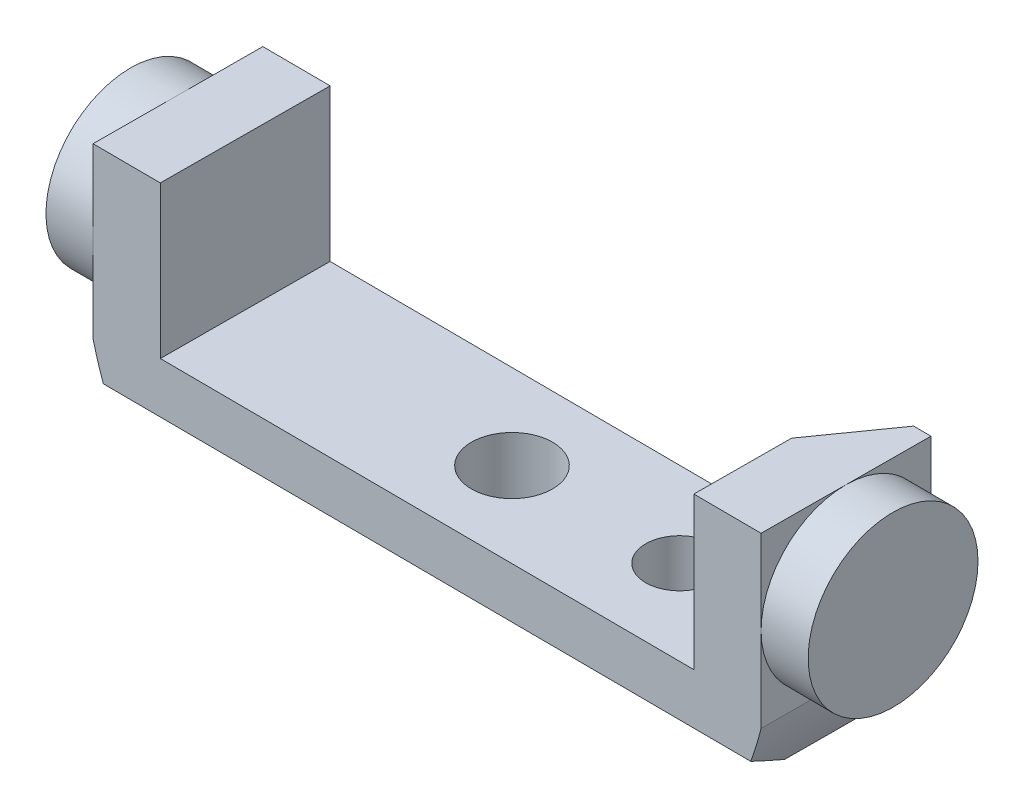
ISO-10303-21;
HEADER;
FILE_DESCRIPTION(('STEP AP214'),'2;1');
FILE_NAME('part.step','',(''),(''),'','','');
FILE_SCHEMA(('AUTOMOTIVE_DESIGN { 1 0 10303 214 1 1 1 1 }'));
ENDSEC;
DATA;
#1=APPLICATION_CONTEXT('core data for automotive mechanical design processes');
#2=APPLICATION_PROTOCOL_DEFINITION('international standard','automotive_design',2000,#1);
#3=PRODUCT_CONTEXT('',#1,'mechanical');
#4=PRODUCT('Part','Part','',(#3));
#5=PRODUCT_RELATED_PRODUCT_CATEGORY('part','',(#4));
#6=PRODUCT_DEFINITION_FORMATION('','',#4);
#7=PRODUCT_DEFINITION_CONTEXT('part definition',#1,'design');
#8=PRODUCT_DEFINITION('design','',#6,#7);
#9=PRODUCT_DEFINITION_SHAPE('','',#8);
#10=(LENGTH_UNIT() NAMED_UNIT(*) SI_UNIT(.MILLI.,.METRE.));
#11=(NAMED_UNIT(*) PLANE_ANGLE_UNIT() SI_UNIT($,.RADIAN.));
#12=(NAMED_UNIT(*) SI_UNIT($,.STERADIAN.) SOLID_ANGLE_UNIT());
#13=UNCERTAINTY_MEASURE_WITH_UNIT(LENGTH_MEASURE(1.E-05),#10,'distance_accuracy_value','');
#14=(GEOMETRIC_REPRESENTATION_CONTEXT(3) GLOBAL_UNCERTAINTY_ASSIGNED_CONTEXT((#13)) GLOBAL_UNIT_ASSIGNED_CONTEXT((#10,
#11,#12)) REPRESENTATION_CONTEXT('',''));
#15=CARTESIAN_POINT('',(0.,0.,0.));
#16=DIRECTION('',(0.,0.,1.));
#17=DIRECTION('',(1.,0.,0.));
#18=AXIS2_PLACEMENT_3D('',#15,#16,#17);
#19=CARTESIAN_POINT('',(0.0124960993634603,-0.875000014901161,-2.49996876930507));
#20=DIRECTION('',(0.00499843974538349,0.,-0.999987507722027));
#21=DIRECTION('',(0.,1.,0.));
#22=AXIS2_PLACEMENT_3D('',#19,#20,#21);
#23=PLANE('',#22);
#24=DIRECTION('',(0.,1.,0.));
#25=VECTOR('',#24,1.);
#26=CARTESIAN_POINT('',(9.43112148233651,-0.312500007450576,-2.45288974971974));
#27=LINE('',#26,#25);
#28=CARTESIAN_POINT('',(9.43112148233652,-2.,-2.45288974971974));
#29=VERTEX_POINT('',#28);
#30=CARTESIAN_POINT('',(9.43112148233651,2.5,-2.45288974971974));
#31=VERTEX_POINT('',#30);
#32=EDGE_CURVE('E11',#29,#31,#27,.T.);
#33=ORIENTED_EDGE('',*,*,#32,.T.);
#34=DIRECTION('',(0.999987507722027,0.,0.00499843974538349));
#35=VECTOR('',#34,1.);
#36=CARTESIAN_POINT('',(9.94529584155588,2.5,-2.45031964806013));
#37=LINE('',#36,#35);
#38=CARTESIAN_POINT('',(9.94529584155588,2.5,-2.45031964806013));
#39=VERTEX_POINT('',#38);
#40=EDGE_CURVE('E24',#31,#39,#37,.T.);
#41=ORIENTED_EDGE('',*,*,#40,.T.);
#42=DIRECTION('',(0.,-1.,0.));
#43=VECTOR('',#42,1.);
#44=CARTESIAN_POINT('',(9.94529584155588,2.5,-2.45031964806013));
#45=LINE('',#44,#43);
#46=CARTESIAN_POINT('',(9.94529584155588,0.,-2.45031964806013));
#47=VERTEX_POINT('',#46);
#48=EDGE_CURVE('E349',#39,#47,#45,.T.);
#49=ORIENTED_EDGE('',*,*,#48,.T.);
#50=DIRECTION('',(0.,-1.,0.));
#51=VECTOR('',#50,1.);
#52=CARTESIAN_POINT('',(9.94529584155588,2.5,-2.45031964806013));
#53=LINE('',#52,#51);
#54=CARTESIAN_POINT('',(9.94529584155588,-2.5,-2.45031964806013));
#55=VERTEX_POINT('',#54);
#56=EDGE_CURVE('E345',#47,#55,#53,.T.);
#57=ORIENTED_EDGE('',*,*,#56,.T.);
#58=CARTESIAN_POINT('',(0.0124960993634587,0.,-2.49996876930507));
#59=DIRECTION('',(0.00499843974538349,0.,-0.999987507722027));
#60=DIRECTION('',(0.,1.,0.));
#61=AXIS2_PLACEMENT_3D('',#58,#59,#60);
#62=CIRCLE('',#61,10.2427035373352);
#63=CARTESIAN_POINT('',(9.3317399309953,-4.25000002980231,-2.45338650862157));
#64=VERTEX_POINT('',#63);
#65=EDGE_CURVE('E341',#55,#64,#62,.T.);
#66=ORIENTED_EDGE('',*,*,#65,.T.);
#67=DIRECTION('',(-0.999987507722027,0.,-0.00499843974538349));
#68=VECTOR('',#67,1.);
#69=CARTESIAN_POINT('',(9.3317399309953,-4.25000002980231,-2.45338650862157));
#70=LINE('',#69,#68);
#71=CARTESIAN_POINT('',(-9.30674773226838,-4.25000002980233,-2.54655102998857));
#72=VERTEX_POINT('',#71);
#73=EDGE_CURVE('E132',#64,#72,#70,.T.);
#74=ORIENTED_EDGE('',*,*,#73,.T.);
#75=CARTESIAN_POINT('',(0.0124960993634587,0.,-2.49996876930507));
#76=DIRECTION('',(0.00499843974538349,0.,-0.999987507722027));
#77=DIRECTION('',(0.,1.,0.));
#78=AXIS2_PLACEMENT_3D('',#75,#76,#77);
#79=CIRCLE('',#78,10.2427035373352);
#80=CARTESIAN_POINT('',(-9.92030364282896,-2.5,-2.54961789055));
#81=VERTEX_POINT('',#80);
#82=EDGE_CURVE('E334',#72,#81,#79,.T.);
#83=ORIENTED_EDGE('',*,*,#82,.T.);
#84=DIRECTION('',(0.,1.,0.));
#85=VECTOR('',#84,1.);
#86=CARTESIAN_POINT('',(-9.92030364282896,-2.5,-2.54961789055));
#87=LINE('',#86,#85);
#88=CARTESIAN_POINT('',(-9.92030364282896,0.,-2.54961789055));
#89=VERTEX_POINT('',#88);
#90=EDGE_CURVE('E330',#81,#89,#87,.T.);
#91=ORIENTED_EDGE('',*,*,#90,.T.);
#92=DIRECTION('',(0.,1.,0.));
#93=VECTOR('',#92,1.);
#94=CARTESIAN_POINT('',(-9.92030364282896,-2.5,-2.54961789055));
#95=LINE('',#94,#93);
#96=CARTESIAN_POINT('',(-9.92030364282896,2.5,-2.54961789055));
#97=VERTEX_POINT('',#96);
#98=EDGE_CURVE('E328',#89,#97,#95,.T.);
#99=ORIENTED_EDGE('',*,*,#98,.T.);
#100=DIRECTION('',(0.999987507722027,0.,0.00499843974538349));
#101=VECTOR('',#100,1.);
#102=CARTESIAN_POINT('',(0.0124960993634586,2.5,-2.49996876930507));
#103=LINE('',#102,#101);
#104=CARTESIAN_POINT('',(-7.92032862738491,2.5,-2.53962101105923));
#105=VERTEX_POINT('',#104);
#106=EDGE_CURVE('E324',#97,#105,#103,.T.);
#107=ORIENTED_EDGE('',*,*,#106,.T.);
#108=DIRECTION('',(0.,-1.,0.));
#109=VECTOR('',#108,1.);
#110=CARTESIAN_POINT('',(-7.92032862738491,2.5,-2.53962101105923));
#111=LINE('',#110,#109);
#112=CARTESIAN_POINT('',(-7.92032862738491,-2.00000002980233,-2.53962101105923));
#113=VERTEX_POINT('',#112);
#114=EDGE_CURVE('E320',#105,#113,#111,.T.);
#115=ORIENTED_EDGE('',*,*,#114,.T.);
#116=DIRECTION('',(0.999987507722027,0.,0.00499843974538349));
#117=VECTOR('',#116,1.);
#118=CARTESIAN_POINT('',(-7.92032862738491,-2.00000002980233,-2.53962101105923));
#119=LINE('',#118,#117);
#120=EDGE_CURVE('E316',#113,#29,#119,.T.);
#121=ORIENTED_EDGE('',*,*,#120,.T.);
#122=EDGE_LOOP('',(#33,#41,#49,#57,#66,#74,#83,#91,#99,#107,#115,#121));
#123=FACE_BOUND('',#122,.T.);
#124=ADVANCED_FACE('F16',(#123),#23,.T.);
#125=CARTESIAN_POINT('',(0.,0.,0.));
#126=DIRECTION('',(0.00499843974538349,0.,-0.999987507722027));
#127=DIRECTION('',(0.,1.,0.));
#128=AXIS2_PLACEMENT_3D('',#125,#126,#127);
#129=CYLINDRICAL_SURFACE('',#128,10.2427035373352);
#130=CARTESIAN_POINT('',(-0.0427975302129893,0.,8.5620709170041));
#131=DIRECTION('',(-0.00249921987269131,-0.866025403784439,0.499993753861014));
#132=DIRECTION('',(-0.00432877579878818,0.5,0.866014585154363));
#133=AXIS2_PLACEMENT_3D('',#130,#131,#132);
#134=ELLIPSE('',#133,20.4854070746703,10.2427035373352);
#135=CARTESIAN_POINT('',(-9.638536843942,-3.50000002980233,2.45185298358092));
#136=VERTEX_POINT('',#135);
#137=CARTESIAN_POINT('',(-9.32524676729712,-4.25000002980233,1.15436463089002));
#138=VERTEX_POINT('',#137);
#139=EDGE_CURVE('E146',#136,#138,#134,.T.);
#140=ORIENTED_EDGE('',*,*,#139,.F.);
#141=CARTESIAN_POINT('',(-0.0124960993634587,0.,2.49996876930507));
#142=DIRECTION('',(-0.00499843974538349,0.,0.999987507722027));
#143=DIRECTION('',(0.,1.,0.));
#144=AXIS2_PLACEMENT_3D('',#141,#142,#143);
#145=CIRCLE('',#144,10.2427035373352);
#146=CARTESIAN_POINT('',(-9.94529584155588,-2.5,2.45031964806013));
#147=VERTEX_POINT('',#146);
#148=EDGE_CURVE('E308',#147,#136,#145,.T.);
#149=ORIENTED_EDGE('',*,*,#148,.F.);
#150=DIRECTION('',(0.00499843974538349,0.,-0.999987507722027));
#151=VECTOR('',#150,1.);
#152=CARTESIAN_POINT('',(-9.93279974219242,-2.5,-0.0496491212449333));
#153=LINE('',#152,#151);
#154=CARTESIAN_POINT('',(-9.93279974219242,-2.5,-0.049649121244933));
#155=VERTEX_POINT('',#154);
#156=EDGE_CURVE('E304',#147,#155,#153,.T.);
#157=ORIENTED_EDGE('',*,*,#156,.T.);
#158=DIRECTION('',(0.00499843974538349,0.,-0.999987507722027));
#159=VECTOR('',#158,1.);
#160=CARTESIAN_POINT('',(-9.93279974219242,-2.5,-0.0496491212449333));
#161=LINE('',#160,#159);
#162=EDGE_CURVE('E299',#155,#81,#161,.T.);
#163=ORIENTED_EDGE('',*,*,#162,.T.);
#164=ORIENTED_EDGE('',*,*,#82,.F.);
#165=DIRECTION('',(-0.00499843974538349,0.,0.999987507722027));
#166=VECTOR('',#165,1.);
#167=CARTESIAN_POINT('',(-9.31924383163184,-4.25000002980233,-0.0465822606834978));
#168=LINE('',#167,#166);
#169=EDGE_CURVE('E297',#72,#138,#168,.T.);
#170=ORIENTED_EDGE('',*,*,#169,.T.);
#171=EDGE_LOOP('',(#140,#149,#157,#163,#164,#170));
#172=FACE_BOUND('',#171,.T.);
#173=ADVANCED_FACE('F386',(#172),#129,.T.);
#174=CARTESIAN_POINT('',(7.93282472674836,2.5,0.0396522417541663));
#175=DIRECTION('',(0.,1.,0.));
#176=DIRECTION('',(0.999987507722027,0.,0.00499843974538349));
#177=AXIS2_PLACEMENT_3D('',#174,#175,#176);
#178=PLANE('',#177);
#179=DIRECTION('',(0.00499843974538349,0.,-0.999987507722027));
#180=VECTOR('',#179,1.);
#181=CARTESIAN_POINT('',(-7.93282472674837,2.5,-0.039652241754166));
#182=LINE('',#181,#180);
#183=CARTESIAN_POINT('',(-7.94532082611183,2.5,2.4603165275509));
#184=VERTEX_POINT('',#183);
#185=EDGE_CURVE('E294',#184,#105,#182,.T.);
#186=ORIENTED_EDGE('',*,*,#185,.T.);
#187=ORIENTED_EDGE('',*,*,#106,.F.);
#188=DIRECTION('',(0.00499843974538349,0.,-0.999987507722027));
#189=VECTOR('',#188,1.);
#190=CARTESIAN_POINT('',(-9.93279974219242,2.5,-0.049649121244933));
#191=LINE('',#190,#189);
#192=CARTESIAN_POINT('',(-9.93279974219242,2.5,-0.049649121244933));
#193=VERTEX_POINT('',#192);
#194=EDGE_CURVE('E293',#193,#97,#191,.T.);
#195=ORIENTED_EDGE('',*,*,#194,.F.);
#196=CARTESIAN_POINT('',(-9.94529584155588,2.5,2.45031964806013));
#197=VERTEX_POINT('',#196);
#198=EDGE_CURVE('E290',#197,#193,#191,.T.);
#199=ORIENTED_EDGE('',*,*,#198,.F.);
#200=DIRECTION('',(-0.999987507722027,0.,-0.00499843974538349));
#201=VECTOR('',#200,1.);
#202=CARTESIAN_POINT('',(-0.0124960993634589,2.5,2.49996876930507));
#203=LINE('',#202,#201);
#204=EDGE_CURVE('E285',#184,#197,#203,.T.);
#205=ORIENTED_EDGE('',*,*,#204,.F.);
#206=EDGE_LOOP('',(#186,#187,#195,#199,#205));
#207=FACE_BOUND('',#206,.T.);
#208=ADVANCED_FACE('F401',(#207),#178,.T.);
#209=CARTESIAN_POINT('',(-7.93282472674837,2.5,-0.039652241754166));
#210=DIRECTION('',(0.999987507722027,0.,0.00499843974538349));
#211=DIRECTION('',(0.,-1.,0.));
#212=AXIS2_PLACEMENT_3D('',#209,#210,#211);
#213=PLANE('',#212);
#214=DIRECTION('',(0.00499843974538349,0.,-0.999987507722027));
#215=VECTOR('',#214,1.);
#216=CARTESIAN_POINT('',(-7.93282472674836,-2.00000002980233,-0.0396522417541663));
#217=LINE('',#216,#215);
#218=CARTESIAN_POINT('',(-7.94532082611182,-2.00000002980233,2.4603165275509));
#219=VERTEX_POINT('',#218);
#220=EDGE_CURVE('E280',#219,#113,#217,.T.);
#221=ORIENTED_EDGE('',*,*,#220,.T.);
#222=ORIENTED_EDGE('',*,*,#114,.F.);
#223=ORIENTED_EDGE('',*,*,#185,.F.);
#224=DIRECTION('',(0.,1.,0.));
#225=VECTOR('',#224,1.);
#226=CARTESIAN_POINT('',(-7.94532082611183,2.5,2.4603165275509));
#227=LINE('',#226,#225);
#228=EDGE_CURVE('E277',#219,#184,#227,.T.);
#229=ORIENTED_EDGE('',*,*,#228,.F.);
#230=EDGE_LOOP('',(#221,#222,#223,#229));
#231=FACE_BOUND('',#230,.T.);
#232=ADVANCED_FACE('F433',(#231),#213,.T.);
#233=CARTESIAN_POINT('',(-7.93282472674836,-2.00000002980233,-0.0396522417541663));
#234=DIRECTION('',(0.,1.,0.));
#235=DIRECTION('',(0.999987507722027,0.,0.00499843974538349));
#236=AXIS2_PLACEMENT_3D('',#233,#234,#235);
#237=PLANE('',#236);
#238=CARTESIAN_POINT('',(4.98245795460769,-2.00000002980232,0.024904826988035));
#239=DIRECTION('',(0.,-1.,0.));
#240=DIRECTION('',(-0.00499843974538349,0.,0.999987507722027));
#241=AXIS2_PLACEMENT_3D('',#238,#239,#240);
#242=CIRCLE('',#241,1.);
#243=CARTESIAN_POINT('',(4.97745951486231,-2.00000002980232,1.02489233471006));
#244=VERTEX_POINT('',#243);
#245=EDGE_CURVE('E274',#244,#244,#242,.T.);
#246=ORIENTED_EDGE('',*,*,#245,.T.);
#247=EDGE_LOOP('',(#246));
#248=FACE_BOUND('',#247,.T.);
#249=CARTESIAN_POINT('',(0.,-2.00000002980232,0.));
#250=DIRECTION('',(0.,-1.,0.));
#251=DIRECTION('',(0.00499843974538349,0.,-0.999987507722027));
#252=AXIS2_PLACEMENT_3D('',#249,#250,#251);
#253=CIRCLE('',#252,1.2);
#254=CARTESIAN_POINT('',(0.00599812769446119,-2.00000002980232,-1.19998500926643));
#255=VERTEX_POINT('',#254);
#256=EDGE_CURVE('E269',#255,#255,#253,.T.);
#257=ORIENTED_EDGE('',*,*,#256,.T.);
#258=EDGE_LOOP('',(#257));
#259=FACE_BOUND('',#258,.T.);
#260=DIRECTION('',(0.00499843974538349,0.,-0.999987507722027));
#261=VECTOR('',#260,1.);
#262=CARTESIAN_POINT('',(7.93282472674837,-2.00000002980232,0.039652241754166));
#263=LINE('',#262,#261);
#264=CARTESIAN_POINT('',(7.92032862738491,-2.00000002980232,2.53962101105923));
#265=VERTEX_POINT('',#264);
#266=CARTESIAN_POINT('',(7.93471428815573,-2.,-0.338373281947489));
#267=VERTEX_POINT('',#266);
#268=EDGE_CURVE('E265',#265,#267,#263,.T.);
#269=ORIENTED_EDGE('',*,*,#268,.T.);
#270=DIRECTION('',(-0.577663753210451,0.,0.81627482395748));
#271=VECTOR('',#270,1.);
#272=CARTESIAN_POINT('',(11.4463171834002,-2.,-5.30048665533063));
#273=LINE('',#272,#271);
#274=EDGE_CURVE('E260',#29,#267,#273,.T.);
#275=ORIENTED_EDGE('',*,*,#274,.F.);
#276=ORIENTED_EDGE('',*,*,#120,.F.);
#277=ORIENTED_EDGE('',*,*,#220,.F.);
#278=DIRECTION('',(-0.999987507722027,0.,-0.00499843974538349));
#279=VECTOR('',#278,1.);
#280=CARTESIAN_POINT('',(-7.94532082611182,-2.00000002980233,2.4603165275509));
#281=LINE('',#280,#279);
#282=EDGE_CURVE('E255',#265,#219,#281,.T.);
#283=ORIENTED_EDGE('',*,*,#282,.F.);
#284=EDGE_LOOP('',(#269,#275,#276,#277,#283));
#285=FACE_BOUND('',#284,.T.);
#286=ADVANCED_FACE('F469',(#248,#259,#285),#237,.T.);
#287=CARTESIAN_POINT('',(-0.0124960993634572,-0.875000014901162,2.49996876930507));
#288=DIRECTION('',(0.00499843974538349,0.,-0.999987507722027));
#289=DIRECTION('',(0.,1.,0.));
#290=AXIS2_PLACEMENT_3D('',#287,#288,#289);
#291=PLANE('',#290);
#292=DIRECTION('',(-0.999987507722027,0.,-0.00499843974538349));
#293=VECTOR('',#292,1.);
#294=CARTESIAN_POINT('',(4.64712581645247,-3.50000002980232,2.52325989964681));
#295=LINE('',#294,#293);
#296=CARTESIAN_POINT('',(9.61354464521508,-3.50000002980232,2.54808455502922));
#297=VERTEX_POINT('',#296);
#298=EDGE_CURVE('E251',#297,#136,#295,.T.);
#299=ORIENTED_EDGE('',*,*,#298,.F.);
#300=CARTESIAN_POINT('',(-0.0124960993634587,0.,2.49996876930507));
#301=DIRECTION('',(-0.00499843974538349,0.,0.999987507722027));
#302=DIRECTION('',(0.,1.,0.));
#303=AXIS2_PLACEMENT_3D('',#300,#301,#302);
#304=CIRCLE('',#303,10.2427035373352);
#305=CARTESIAN_POINT('',(9.92030364282896,-2.5,2.54961789055));
#306=VERTEX_POINT('',#305);
#307=EDGE_CURVE('E141',#297,#306,#304,.T.);
#308=ORIENTED_EDGE('',*,*,#307,.T.);
#309=DIRECTION('',(0.,1.,0.));
#310=VECTOR('',#309,1.);
#311=CARTESIAN_POINT('',(9.92030364282896,2.5,2.54961789055));
#312=LINE('',#311,#310);
#313=CARTESIAN_POINT('',(9.92030364282896,0.,2.54961789055));
#314=VERTEX_POINT('',#313);
#315=EDGE_CURVE('E244',#306,#314,#312,.T.);
#316=ORIENTED_EDGE('',*,*,#315,.T.);
#317=DIRECTION('',(0.,1.,0.));
#318=VECTOR('',#317,1.);
#319=CARTESIAN_POINT('',(9.92030364282896,2.5,2.54961789055));
#320=LINE('',#319,#318);
#321=CARTESIAN_POINT('',(9.92030364282896,2.5,2.54961789055));
#322=VERTEX_POINT('',#321);
#323=EDGE_CURVE('E240',#314,#322,#320,.T.);
#324=ORIENTED_EDGE('',*,*,#323,.T.);
#325=DIRECTION('',(-0.999987507722027,0.,-0.00499843974538349));
#326=VECTOR('',#325,1.);
#327=CARTESIAN_POINT('',(9.92030364282896,2.5,2.54961789055));
#328=LINE('',#327,#326);
#329=CARTESIAN_POINT('',(7.92032862738491,2.5,2.53962101105923));
#330=VERTEX_POINT('',#329);
#331=EDGE_CURVE('E236',#322,#330,#328,.T.);
#332=ORIENTED_EDGE('',*,*,#331,.T.);
#333=DIRECTION('',(0.,-1.,0.));
#334=VECTOR('',#333,1.);
#335=CARTESIAN_POINT('',(7.92032862738491,2.5,2.53962101105923));
#336=LINE('',#335,#334);
#337=EDGE_CURVE('E231',#330,#265,#336,.T.);
#338=ORIENTED_EDGE('',*,*,#337,.T.);
#339=ORIENTED_EDGE('',*,*,#282,.T.);
#340=ORIENTED_EDGE('',*,*,#228,.T.);
#341=ORIENTED_EDGE('',*,*,#204,.T.);
#342=DIRECTION('',(0.,-1.,0.));
#343=VECTOR('',#342,1.);
#344=CARTESIAN_POINT('',(-9.94529584155588,-2.5,2.45031964806013));
#345=LINE('',#344,#343);
#346=CARTESIAN_POINT('',(-9.94529584155588,0.,2.45031964806013));
#347=VERTEX_POINT('',#346);
#348=EDGE_CURVE('E227',#197,#347,#345,.T.);
#349=ORIENTED_EDGE('',*,*,#348,.T.);
#350=DIRECTION('',(0.,-1.,0.));
#351=VECTOR('',#350,1.);
#352=CARTESIAN_POINT('',(-9.94529584155588,-2.5,2.45031964806013));
#353=LINE('',#352,#351);
#354=EDGE_CURVE('E224',#347,#147,#353,.T.);
#355=ORIENTED_EDGE('',*,*,#354,.T.);
#356=ORIENTED_EDGE('',*,*,#148,.T.);
#357=EDGE_LOOP('',(#299,#308,#316,#324,#332,#338,#339,#340,#341,#349,#355,#356));
#358=FACE_BOUND('',#357,.T.);
#359=ADVANCED_FACE('F381',(#358),#291,.F.);
#360=CARTESIAN_POINT('',(9.93279974219242,2.5,0.0496491212449333));
#361=DIRECTION('',(0.999987507722027,0.,0.00499843974538349));
#362=DIRECTION('',(0.,-1.,0.));
#363=AXIS2_PLACEMENT_3D('',#360,#361,#362);
#364=PLANE('',#363);
#365=CARTESIAN_POINT('',(9.93279974219242,0.,0.0496491212449332));
#366=DIRECTION('',(-0.999987507722027,0.,-0.00499843974538349));
#367=DIRECTION('',(0.00499843974538349,0.,-0.999987507722027));
#368=AXIS2_PLACEMENT_3D('',#365,#366,#367);
#369=CIRCLE('',#368,2.5);
#370=CARTESIAN_POINT('',(9.93279974219242,2.5,0.0496491212449334));
#371=VERTEX_POINT('',#370);
#372=EDGE_CURVE('E219',#314,#371,#369,.T.);
#373=ORIENTED_EDGE('',*,*,#372,.T.);
#374=DIRECTION('',(0.00499843974538349,0.,-0.999987507722027));
#375=VECTOR('',#374,1.);
#376=CARTESIAN_POINT('',(9.93279974219242,2.5,0.0496491212449333));
#377=LINE('',#376,#375);
#378=EDGE_CURVE('E216',#322,#371,#377,.T.);
#379=ORIENTED_EDGE('',*,*,#378,.F.);
#380=ORIENTED_EDGE('',*,*,#323,.F.);
#381=EDGE_LOOP('',(#373,#379,#380));
#382=FACE_BOUND('',#381,.T.);
#383=ADVANCED_FACE('F378',(#382),#364,.T.);
#384=CARTESIAN_POINT('',(9.93279974219242,-2.5,0.049649121244933));
#385=VERTEX_POINT('',#384);
#386=EDGE_CURVE('E213',#385,#314,#369,.T.);
#387=ORIENTED_EDGE('',*,*,#386,.T.);
#388=ORIENTED_EDGE('',*,*,#315,.F.);
#389=DIRECTION('',(0.00499843974538349,0.,-0.999987507722027));
#390=VECTOR('',#389,1.);
#391=CARTESIAN_POINT('',(9.93279974219242,-2.5,0.049649121244933));
#392=LINE('',#391,#390);
#393=EDGE_CURVE('E211',#306,#385,#392,.T.);
#394=ORIENTED_EDGE('',*,*,#393,.T.);
#395=EDGE_LOOP('',(#387,#388,#394));
#396=FACE_BOUND('',#395,.T.);
#397=ADVANCED_FACE('F383',(#396),#364,.T.);
#398=EDGE_CURVE('E208',#47,#385,#369,.T.);
#399=ORIENTED_EDGE('',*,*,#398,.T.);
#400=DIRECTION('',(0.00499843974538349,0.,-0.999987507722027));
#401=VECTOR('',#400,1.);
#402=CARTESIAN_POINT('',(9.93279974219242,-2.5,0.049649121244933));
#403=LINE('',#402,#401);
#404=EDGE_CURVE('E205',#385,#55,#403,.T.);
#405=ORIENTED_EDGE('',*,*,#404,.T.);
#406=ORIENTED_EDGE('',*,*,#56,.F.);
#407=EDGE_LOOP('',(#399,#405,#406));
#408=FACE_BOUND('',#407,.T.);
#409=ADVANCED_FACE('F362',(#408),#364,.T.);
#410=EDGE_CURVE('E202',#371,#47,#369,.T.);
#411=ORIENTED_EDGE('',*,*,#410,.T.);
#412=ORIENTED_EDGE('',*,*,#48,.F.);
#413=DIRECTION('',(0.00499843974538349,0.,-0.999987507722027));
#414=VECTOR('',#413,1.);
#415=CARTESIAN_POINT('',(9.93279974219242,2.5,0.0496491212449333));
#416=LINE('',#415,#414);
#417=EDGE_CURVE('E199',#371,#39,#416,.T.);
#418=ORIENTED_EDGE('',*,*,#417,.F.);
#419=EDGE_LOOP('',(#411,#412,#418));
#420=FACE_BOUND('',#419,.T.);
#421=ADVANCED_FACE('F367',(#420),#364,.T.);
#422=CARTESIAN_POINT('',(11.3327822530033,0.,0.0566469368884703));
#423=DIRECTION('',(0.999987507722027,0.,0.00499843974538349));
#424=DIRECTION('',(0.,-1.,0.));
#425=AXIS2_PLACEMENT_3D('',#422,#423,#424);
#426=PLANE('',#425);
#427=CARTESIAN_POINT('',(11.3327822530033,0.,0.0566469368884703));
#428=DIRECTION('',(0.999987507722027,0.,0.00499843974538349));
#429=DIRECTION('',(0.00499843974538349,0.,-0.999987507722027));
#430=AXIS2_PLACEMENT_3D('',#427,#428,#429);
#431=CIRCLE('',#430,2.5);
#432=CARTESIAN_POINT('',(11.3452783523668,0.,-2.4433218324166));
#433=VERTEX_POINT('',#432);
#434=EDGE_CURVE('E194',#433,#433,#431,.T.);
#435=ORIENTED_EDGE('',*,*,#434,.T.);
#436=EDGE_LOOP('',(#435));
#437=FACE_BOUND('',#436,.T.);
#438=ADVANCED_FACE('F494',(#437),#426,.T.);
#439=CARTESIAN_POINT('',(-9.93279974219242,0.,-0.0496491212449332));
#440=DIRECTION('',(-0.999987507722027,0.,-0.00499843974538349));
#441=DIRECTION('',(0.,1.,0.));
#442=AXIS2_PLACEMENT_3D('',#439,#440,#441);
#443=CYLINDRICAL_SURFACE('',#442,2.5);
#444=ORIENTED_EDGE('',*,*,#410,.F.);
#445=ORIENTED_EDGE('',*,*,#372,.F.);
#446=ORIENTED_EDGE('',*,*,#386,.F.);
#447=ORIENTED_EDGE('',*,*,#398,.F.);
#448=EDGE_LOOP('',(#444,#445,#446,#447));
#449=FACE_BOUND('',#448,.T.);
#450=ORIENTED_EDGE('',*,*,#434,.F.);
#451=EDGE_LOOP('',(#450));
#452=FACE_BOUND('',#451,.T.);
#453=ADVANCED_FACE('F370',(#449,#452),#443,.T.);
#454=CARTESIAN_POINT('',(-9.93279974219242,-2.5,-0.0496491212449333));
#455=DIRECTION('',(-0.999987507722027,0.,-0.00499843974538349));
#456=DIRECTION('',(0.,1.,0.));
#457=AXIS2_PLACEMENT_3D('',#454,#455,#456);
#458=PLANE('',#457);
#459=CARTESIAN_POINT('',(-9.93279974219242,0.,-0.0496491212449332));
#460=DIRECTION('',(0.999987507722027,0.,0.00499843974538349));
#461=DIRECTION('',(0.,1.,0.));
#462=AXIS2_PLACEMENT_3D('',#459,#460,#461);
#463=CIRCLE('',#462,2.5);
#464=EDGE_CURVE('E189',#347,#155,#463,.T.);
#465=ORIENTED_EDGE('',*,*,#464,.T.);
#466=ORIENTED_EDGE('',*,*,#156,.F.);
#467=ORIENTED_EDGE('',*,*,#354,.F.);
#468=EDGE_LOOP('',(#465,#466,#467));
#469=FACE_BOUND('',#468,.T.);
#470=ADVANCED_FACE('F408',(#469),#458,.T.);
#471=CARTESIAN_POINT('',(-9.93279974219242,0.,-0.0496491212449332));
#472=DIRECTION('',(0.999987507722027,0.,0.00499843974538349));
#473=DIRECTION('',(0.,1.,0.));
#474=AXIS2_PLACEMENT_3D('',#471,#472,#473);
#475=CIRCLE('',#474,2.5);
#476=EDGE_CURVE('E184',#193,#347,#475,.T.);
#477=ORIENTED_EDGE('',*,*,#476,.T.);
#478=ORIENTED_EDGE('',*,*,#348,.F.);
#479=ORIENTED_EDGE('',*,*,#198,.T.);
#480=EDGE_LOOP('',(#477,#478,#479));
#481=FACE_BOUND('',#480,.T.);
#482=ADVANCED_FACE('F404',(#481),#458,.T.);
#483=CARTESIAN_POINT('',(-9.93279974219242,0.,-0.0496491212449332));
#484=DIRECTION('',(0.999987507722027,0.,0.00499843974538349));
#485=DIRECTION('',(0.,1.,0.));
#486=AXIS2_PLACEMENT_3D('',#483,#484,#485);
#487=CIRCLE('',#486,2.5);
#488=EDGE_CURVE('E179',#89,#193,#487,.T.);
#489=ORIENTED_EDGE('',*,*,#488,.T.);
#490=ORIENTED_EDGE('',*,*,#194,.T.);
#491=ORIENTED_EDGE('',*,*,#98,.F.);
#492=EDGE_LOOP('',(#489,#490,#491));
#493=FACE_BOUND('',#492,.T.);
#494=ADVANCED_FACE('F398',(#493),#458,.T.);
#495=CARTESIAN_POINT('',(-9.93279974219242,0.,-0.0496491212449332));
#496=DIRECTION('',(0.999987507722027,0.,0.00499843974538349));
#497=DIRECTION('',(0.,1.,0.));
#498=AXIS2_PLACEMENT_3D('',#495,#496,#497);
#499=CIRCLE('',#498,2.5);
#500=EDGE_CURVE('E176',#155,#89,#499,.T.);
#501=ORIENTED_EDGE('',*,*,#500,.T.);
#502=ORIENTED_EDGE('',*,*,#90,.F.);
#503=ORIENTED_EDGE('',*,*,#162,.F.);
#504=EDGE_LOOP('',(#501,#502,#503));
#505=FACE_BOUND('',#504,.T.);
#506=ADVANCED_FACE('F392',(#505),#458,.T.);
#507=CARTESIAN_POINT('',(-11.3327822530033,0.,-0.0566469368884703));
#508=DIRECTION('',(-0.999987507722027,0.,-0.00499843974538349));
#509=DIRECTION('',(0.,1.,0.));
#510=AXIS2_PLACEMENT_3D('',#507,#508,#509);
#511=PLANE('',#510);
#512=CARTESIAN_POINT('',(-11.3327822530033,0.,-0.0566469368884703));
#513=DIRECTION('',(-0.999987507722027,0.,-0.00499843974538349));
#514=DIRECTION('',(0.,1.,0.));
#515=AXIS2_PLACEMENT_3D('',#512,#513,#514);
#516=CIRCLE('',#515,2.5);
#517=CARTESIAN_POINT('',(-11.3327822530033,2.49999999999999,-0.0566469368884701));
#518=VERTEX_POINT('',#517);
#519=EDGE_CURVE('E173',#518,#518,#516,.T.);
#520=ORIENTED_EDGE('',*,*,#519,.T.);
#521=EDGE_LOOP('',(#520));
#522=FACE_BOUND('',#521,.T.);
#523=ADVANCED_FACE('F414',(#522),#511,.T.);
#524=ORIENTED_EDGE('',*,*,#500,.F.);
#525=ORIENTED_EDGE('',*,*,#464,.F.);
#526=ORIENTED_EDGE('',*,*,#476,.F.);
#527=ORIENTED_EDGE('',*,*,#488,.F.);
#528=EDGE_LOOP('',(#524,#525,#526,#527));
#529=FACE_BOUND('',#528,.T.);
#530=ORIENTED_EDGE('',*,*,#519,.F.);
#531=EDGE_LOOP('',(#530));
#532=FACE_BOUND('',#531,.T.);
#533=ADVANCED_FACE('F410',(#529,#532),#443,.T.);
#534=CARTESIAN_POINT('',(4.98245795460769,-2.00000002980232,0.024904826988035));
#535=DIRECTION('',(0.,-1.,0.));
#536=DIRECTION('',(-0.00499843974538349,0.,0.999987507722027));
#537=AXIS2_PLACEMENT_3D('',#534,#535,#536);
#538=CYLINDRICAL_SURFACE('',#537,1.);
#539=CARTESIAN_POINT('',(4.98245795460769,-4.25000002980232,0.0249048269880348));
#540=DIRECTION('',(0.,1.,0.));
#541=DIRECTION('',(-0.00499843974538349,0.,0.999987507722027));
#542=AXIS2_PLACEMENT_3D('',#539,#540,#541);
#543=CIRCLE('',#542,1.);
#544=CARTESIAN_POINT('',(4.97745951486231,-4.25000002980232,1.02489233471006));
#545=VERTEX_POINT('',#544);
#546=EDGE_CURVE('E168',#545,#545,#543,.T.);
#547=ORIENTED_EDGE('',*,*,#546,.F.);
#548=EDGE_LOOP('',(#547));
#549=FACE_BOUND('',#548,.T.);
#550=ORIENTED_EDGE('',*,*,#245,.F.);
#551=EDGE_LOOP('',(#550));
#552=FACE_BOUND('',#551,.T.);
#553=ADVANCED_FACE('F413',(#549,#552),#538,.F.);
#554=CARTESIAN_POINT('',(7.93282472674837,-2.00000002980232,0.039652241754166));
#555=DIRECTION('',(-0.999987507722027,0.,-0.00499843974538349));
#556=DIRECTION('',(0.,1.,0.));
#557=AXIS2_PLACEMENT_3D('',#554,#555,#556);
#558=PLANE('',#557);
#559=DIRECTION('',(0.,-1.,0.));
#560=VECTOR('',#559,1.);
#561=CARTESIAN_POINT('',(7.93471428815573,-0.875000014901157,-0.338373281947487));
#562=LINE('',#561,#560);
#563=CARTESIAN_POINT('',(7.93471428815573,2.5,-0.338373281947489));
#564=VERTEX_POINT('',#563);
#565=EDGE_CURVE('E163',#564,#267,#562,.T.);
#566=ORIENTED_EDGE('',*,*,#565,.T.);
#567=ORIENTED_EDGE('',*,*,#268,.F.);
#568=ORIENTED_EDGE('',*,*,#337,.F.);
#569=DIRECTION('',(0.00499843974538349,0.,-0.999987507722027));
#570=VECTOR('',#569,1.);
#571=CARTESIAN_POINT('',(7.93282472674836,2.5,0.0396522417541663));
#572=LINE('',#571,#570);
#573=EDGE_CURVE('E159',#330,#564,#572,.T.);
#574=ORIENTED_EDGE('',*,*,#573,.T.);
#575=EDGE_LOOP('',(#566,#567,#568,#574));
#576=FACE_BOUND('',#575,.T.);
#577=ADVANCED_FACE('F457',(#576),#558,.T.);
#578=DIRECTION('',(-0.577663753210451,0.,0.81627482395748));
#579=VECTOR('',#578,1.);
#580=CARTESIAN_POINT('',(8.59347697910565,2.5,-1.26924595068665));
#581=LINE('',#580,#579);
#582=EDGE_CURVE('E150',#31,#564,#581,.T.);
#583=ORIENTED_EDGE('',*,*,#582,.T.);
#584=ORIENTED_EDGE('',*,*,#573,.F.);
#585=ORIENTED_EDGE('',*,*,#331,.F.);
#586=ORIENTED_EDGE('',*,*,#378,.T.);
#587=ORIENTED_EDGE('',*,*,#417,.T.);
#588=ORIENTED_EDGE('',*,*,#40,.F.);
#589=EDGE_LOOP('',(#583,#584,#585,#586,#587,#588));
#590=FACE_BOUND('',#589,.T.);
#591=ADVANCED_FACE('F435',(#590),#178,.T.);
#592=CARTESIAN_POINT('',(9.43112148233651,0.250000000000005,-2.45288974971974));
#593=DIRECTION('',(0.81627482395748,0.,0.577663753210451));
#594=DIRECTION('',(-0.577663753210451,0.,0.81627482395748));
#595=AXIS2_PLACEMENT_3D('',#592,#593,#594);
#596=PLANE('',#595);
#597=ORIENTED_EDGE('',*,*,#565,.F.);
#598=ORIENTED_EDGE('',*,*,#582,.F.);
#599=ORIENTED_EDGE('',*,*,#32,.F.);
#600=ORIENTED_EDGE('',*,*,#274,.T.);
#601=EDGE_LOOP('',(#597,#598,#599,#600));
#602=FACE_BOUND('',#601,.T.);
#603=ADVANCED_FACE('F449',(#602),#596,.F.);
#604=CARTESIAN_POINT('',(0.,-5.59999994039536,0.));
#605=DIRECTION('',(0.,1.,0.));
#606=DIRECTION('',(0.00499843974538349,0.,-0.999987507722027));
#607=AXIS2_PLACEMENT_3D('',#604,#605,#606);
#608=CYLINDRICAL_SURFACE('',#607,1.2);
#609=ORIENTED_EDGE('',*,*,#256,.F.);
#610=EDGE_LOOP('',(#609));
#611=FACE_BOUND('',#610,.T.);
#612=CARTESIAN_POINT('',(0.,-4.25000002980232,0.));
#613=DIRECTION('',(0.,1.,0.));
#614=DIRECTION('',(0.00499843974538349,0.,-0.999987507722027));
#615=AXIS2_PLACEMENT_3D('',#612,#613,#614);
#616=CIRCLE('',#615,1.2);
#617=CARTESIAN_POINT('',(0.00599812769446231,-4.25000002980232,-1.19998500926643));
#618=VERTEX_POINT('',#617);
#619=EDGE_CURVE('E147',#618,#618,#616,.T.);
#620=ORIENTED_EDGE('',*,*,#619,.F.);
#621=EDGE_LOOP('',(#620));
#622=FACE_BOUND('',#621,.T.);
#623=ADVANCED_FACE('F442',(#611,#622),#608,.F.);
#624=CARTESIAN_POINT('',(9.31924383163184,-4.25000002980231,0.0465822606834973));
#625=DIRECTION('',(0.,-1.,0.));
#626=DIRECTION('',(-0.999987507722027,0.,-0.00499843974538349));
#627=AXIS2_PLACEMENT_3D('',#624,#625,#626);
#628=PLANE('',#627);
#629=ORIENTED_EDGE('',*,*,#619,.T.);
#630=EDGE_LOOP('',(#629));
#631=FACE_BOUND('',#630,.T.);
#632=ORIENTED_EDGE('',*,*,#546,.T.);
#633=EDGE_LOOP('',(#632));
#634=FACE_BOUND('',#633,.T.);
#635=DIRECTION('',(0.999987507722027,0.,0.00499843974538349));
#636=VECTOR('',#635,1.);
#637=CARTESIAN_POINT('',(4.65361898015065,-4.25000002980232,1.22423802191527));
#638=LINE('',#637,#636);
#639=CARTESIAN_POINT('',(9.31324089596656,-4.25000002980231,1.24752915225702));
#640=VERTEX_POINT('',#639);
#641=EDGE_CURVE('E130',#138,#640,#638,.T.);
#642=ORIENTED_EDGE('',*,*,#641,.F.);
#643=ORIENTED_EDGE('',*,*,#169,.F.);
#644=ORIENTED_EDGE('',*,*,#73,.F.);
#645=DIRECTION('',(0.00499843974538349,0.,-0.999987507722027));
#646=VECTOR('',#645,1.);
#647=CARTESIAN_POINT('',(9.31924383163184,-4.25000002980231,0.0465822606834973));
#648=LINE('',#647,#646);
#649=EDGE_CURVE('E125',#640,#64,#648,.T.);
#650=ORIENTED_EDGE('',*,*,#649,.F.);
#651=EDGE_LOOP('',(#642,#643,#644,#650));
#652=FACE_BOUND('',#651,.T.);
#653=ADVANCED_FACE('F127',(#631,#634,#652),#628,.T.);
#654=CARTESIAN_POINT('',(-0.0427975302129893,0.,8.5620709170041));
#655=DIRECTION('',(-0.00249921987269131,-0.866025403784439,0.499993753861014));
#656=DIRECTION('',(-0.00432877579878818,0.5,0.866014585154363));
#657=AXIS2_PLACEMENT_3D('',#654,#655,#656);
#658=ELLIPSE('',#657,20.4854070746703,10.2427035373352);
#659=EDGE_CURVE('E135',#640,#297,#658,.T.);
#660=ORIENTED_EDGE('',*,*,#659,.F.);
#661=ORIENTED_EDGE('',*,*,#649,.T.);
#662=ORIENTED_EDGE('',*,*,#65,.F.);
#663=ORIENTED_EDGE('',*,*,#404,.F.);
#664=ORIENTED_EDGE('',*,*,#393,.F.);
#665=ORIENTED_EDGE('',*,*,#307,.F.);
#666=EDGE_LOOP('',(#660,#661,#662,#663,#664,#665));
#667=FACE_BOUND('',#666,.T.);
#668=ADVANCED_FACE('F139',(#667),#129,.T.);
#669=CARTESIAN_POINT('',(4.65037239830156,-3.87500002980232,1.87374896078104));
#670=DIRECTION('',(-0.00249921987269131,-0.866025403784439,0.499993753861014));
#671=DIRECTION('',(0.00432877579878818,-0.5,-0.866014585154363));
#672=AXIS2_PLACEMENT_3D('',#669,#670,#671);
#673=PLANE('',#672);
#674=ORIENTED_EDGE('',*,*,#659,.T.);
#675=ORIENTED_EDGE('',*,*,#298,.T.);
#676=ORIENTED_EDGE('',*,*,#139,.T.);
#677=ORIENTED_EDGE('',*,*,#641,.T.);
#678=EDGE_LOOP('',(#674,#675,#676,#677));
#679=FACE_BOUND('',#678,.T.);
#680=ADVANCED_FACE('F145',(#679),#673,.T.);
#681=CLOSED_SHELL('',(#124,#173,#208,#232,#286,#359,#383,#397,#409,#421,#438,#453,#470,#482,
#494,#506,#523,#533,#553,#577,#591,#603,#623,#653,#668,#680));
#682=MANIFOLD_SOLID_BREP('B1',#681);
#683=ADVANCED_BREP_SHAPE_REPRESENTATION('',(#18,#682),#14);
#684=SHAPE_DEFINITION_REPRESENTATION(#9,#683);
ENDSEC;
END-ISO-10303-21;
